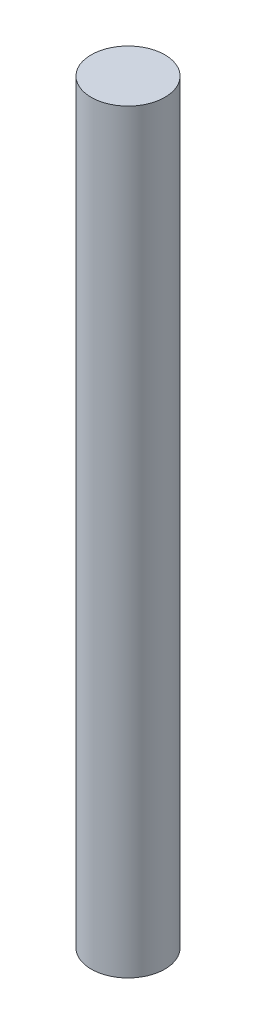
ISO-10303-21;
HEADER;
FILE_DESCRIPTION(('STEP AP214'),'2;1');
FILE_NAME('part.step','',(''),(''),'','','');
FILE_SCHEMA(('AUTOMOTIVE_DESIGN { 1 0 10303 214 1 1 1 1 }'));
ENDSEC;
DATA;
#1=APPLICATION_CONTEXT('core data for automotive mechanical design processes');
#2=APPLICATION_PROTOCOL_DEFINITION('international standard','automotive_design',2000,#1);
#3=PRODUCT_CONTEXT('',#1,'mechanical');
#4=PRODUCT('Part','Part','',(#3));
#5=PRODUCT_RELATED_PRODUCT_CATEGORY('part','',(#4));
#6=PRODUCT_DEFINITION_FORMATION('','',#4);
#7=PRODUCT_DEFINITION_CONTEXT('part definition',#1,'design');
#8=PRODUCT_DEFINITION('design','',#6,#7);
#9=PRODUCT_DEFINITION_SHAPE('','',#8);
#10=(LENGTH_UNIT() NAMED_UNIT(*) SI_UNIT(.MILLI.,.METRE.));
#11=(NAMED_UNIT(*) PLANE_ANGLE_UNIT() SI_UNIT($,.RADIAN.));
#12=(NAMED_UNIT(*) SI_UNIT($,.STERADIAN.) SOLID_ANGLE_UNIT());
#13=UNCERTAINTY_MEASURE_WITH_UNIT(LENGTH_MEASURE(1.E-05),#10,'distance_accuracy_value','');
#14=(GEOMETRIC_REPRESENTATION_CONTEXT(3) GLOBAL_UNCERTAINTY_ASSIGNED_CONTEXT((#13)) GLOBAL_UNIT_ASSIGNED_CONTEXT((#10,
#11,#12)) REPRESENTATION_CONTEXT('',''));
#15=CARTESIAN_POINT('',(0.,0.,0.));
#16=DIRECTION('',(0.,0.,1.));
#17=DIRECTION('',(1.,0.,0.));
#18=AXIS2_PLACEMENT_3D('',#15,#16,#17);
#19=CARTESIAN_POINT('',(0.,205.,0.));
#20=DIRECTION('',(0.,-1.,0.));
#21=DIRECTION('',(0.,0.,-1.));
#22=AXIS2_PLACEMENT_3D('',#19,#20,#21);
#23=CYLINDRICAL_SURFACE('',#22,10.);
#24=CARTESIAN_POINT('',(0.,205.,0.));
#25=DIRECTION('',(0.,1.,0.));
#26=DIRECTION('',(0.,0.,1.));
#27=AXIS2_PLACEMENT_3D('',#24,#25,#26);
#28=CIRCLE('',#27,10.);
#29=CARTESIAN_POINT('',(0.,205.,-10.));
#30=VERTEX_POINT('',#29);
#31=EDGE_CURVE('E10',#30,#30,#28,.T.);
#32=CARTESIAN_POINT('',(0.,0.,0.));
#33=DIRECTION('',(0.,1.,0.));
#34=DIRECTION('',(0.,0.,1.));
#35=AXIS2_PLACEMENT_3D('',#32,#33,#34);
#36=CIRCLE('',#35,10.);
#37=CARTESIAN_POINT('',(0.,0.,-10.));
#38=VERTEX_POINT('',#37);
#39=EDGE_CURVE('E38',#38,#38,#36,.T.);
#40=CARTESIAN_POINT('',(0.,205.,-10.));
#41=CARTESIAN_POINT('',(0.,202.864583333333,-10.));
#42=CARTESIAN_POINT('',(0.,200.729166666667,-10.));
#43=CARTESIAN_POINT('',(0.,196.458333333333,-10.));
#44=CARTESIAN_POINT('',(0.,194.322916666667,-10.));
#45=CARTESIAN_POINT('',(0.,190.052083333333,-10.));
#46=CARTESIAN_POINT('',(0.,187.916666666667,-10.));
#47=CARTESIAN_POINT('',(0.,183.645833333333,-10.));
#48=CARTESIAN_POINT('',(0.,181.510416666667,-10.));
#49=CARTESIAN_POINT('',(0.,177.239583333333,-10.));
#50=CARTESIAN_POINT('',(0.,175.104166666667,-10.));
#51=CARTESIAN_POINT('',(0.,170.833333333333,-10.));
#52=CARTESIAN_POINT('',(0.,168.697916666667,-10.));
#53=CARTESIAN_POINT('',(0.,164.427083333333,-10.));
#54=CARTESIAN_POINT('',(0.,162.291666666667,-10.));
#55=CARTESIAN_POINT('',(0.,158.020833333333,-10.));
#56=CARTESIAN_POINT('',(0.,155.885416666667,-10.));
#57=CARTESIAN_POINT('',(0.,151.614583333333,-10.));
#58=CARTESIAN_POINT('',(0.,149.479166666667,-10.));
#59=CARTESIAN_POINT('',(0.,145.208333333333,-10.));
#60=CARTESIAN_POINT('',(0.,143.072916666667,-10.));
#61=CARTESIAN_POINT('',(0.,138.802083333333,-10.));
#62=CARTESIAN_POINT('',(0.,136.666666666667,-10.));
#63=CARTESIAN_POINT('',(0.,132.395833333333,-10.));
#64=CARTESIAN_POINT('',(0.,130.260416666667,-10.));
#65=CARTESIAN_POINT('',(0.,125.989583333333,-10.));
#66=CARTESIAN_POINT('',(0.,123.854166666667,-10.));
#67=CARTESIAN_POINT('',(0.,119.583333333333,-10.));
#68=CARTESIAN_POINT('',(0.,117.447916666667,-10.));
#69=CARTESIAN_POINT('',(0.,113.177083333333,-10.));
#70=CARTESIAN_POINT('',(0.,111.041666666667,-10.));
#71=CARTESIAN_POINT('',(0.,106.770833333333,-10.));
#72=CARTESIAN_POINT('',(0.,104.635416666667,-10.));
#73=CARTESIAN_POINT('',(0.,100.364583333333,-10.));
#74=CARTESIAN_POINT('',(0.,98.2291666666667,-10.));
#75=CARTESIAN_POINT('',(0.,93.9583333333333,-10.));
#76=CARTESIAN_POINT('',(0.,91.8229166666667,-10.));
#77=CARTESIAN_POINT('',(0.,87.5520833333333,-10.));
#78=CARTESIAN_POINT('',(0.,85.4166666666667,-10.));
#79=CARTESIAN_POINT('',(0.,81.1458333333333,-10.));
#80=CARTESIAN_POINT('',(0.,79.0104166666667,-10.));
#81=CARTESIAN_POINT('',(0.,74.7395833333333,-10.));
#82=CARTESIAN_POINT('',(0.,72.6041666666667,-10.));
#83=CARTESIAN_POINT('',(0.,68.3333333333333,-10.));
#84=CARTESIAN_POINT('',(0.,66.1979166666667,-10.));
#85=CARTESIAN_POINT('',(0.,61.9270833333333,-10.));
#86=CARTESIAN_POINT('',(0.,59.7916666666667,-10.));
#87=CARTESIAN_POINT('',(0.,55.5208333333333,-10.));
#88=CARTESIAN_POINT('',(0.,53.3854166666667,-10.));
#89=CARTESIAN_POINT('',(0.,49.1145833333333,-10.));
#90=CARTESIAN_POINT('',(0.,46.9791666666667,-10.));
#91=CARTESIAN_POINT('',(0.,42.7083333333333,-10.));
#92=CARTESIAN_POINT('',(0.,40.5729166666667,-10.));
#93=CARTESIAN_POINT('',(0.,36.3020833333333,-10.));
#94=CARTESIAN_POINT('',(0.,34.1666666666667,-10.));
#95=CARTESIAN_POINT('',(0.,29.8958333333333,-10.));
#96=CARTESIAN_POINT('',(0.,27.7604166666667,-10.));
#97=CARTESIAN_POINT('',(0.,23.4895833333333,-10.));
#98=CARTESIAN_POINT('',(0.,21.3541666666667,-10.));
#99=CARTESIAN_POINT('',(0.,17.0833333333333,-10.));
#100=CARTESIAN_POINT('',(0.,14.9479166666667,-10.));
#101=CARTESIAN_POINT('',(0.,10.6770833333333,-10.));
#102=CARTESIAN_POINT('',(0.,8.54166666666667,-10.));
#103=CARTESIAN_POINT('',(0.,4.27083333333333,-10.));
#104=CARTESIAN_POINT('',(0.,2.13541666666667,-10.));
#105=CARTESIAN_POINT('',(0.,0.,-10.));
#106=B_SPLINE_CURVE_WITH_KNOTS('',3,(#40,#41,#42,#43,#44,#45,#46,#47,#48,#49,#50,#51,#52,#53,
#54,#55,#56,#57,#58,#59,#60,#61,#62,#63,#64,#65,#66,#67,#68,#69,#70,#71,#72,#73,#74,#75,#76,#77,
#78,#79,#80,#81,#82,#83,#84,#85,#86,#87,#88,#89,#90,#91,#92,#93,#94,#95,#96,#97,#98,#99,#100,
#101,#102,#103,#104,#105),.UNSPECIFIED.,.F.,.F.,(4,2,2,2,2,2,2,2,2,2,2,2,2,2,2,2,2,2,2,2,2,2,2,
2,2,2,2,2,2,2,2,2,4),(0.,6.40624999999997,12.8125,19.21875,25.625,32.03125,38.4375,44.84375,
51.25,57.65625,64.0625,70.46875,76.875,83.28125,89.6875,96.09375,102.5,108.90625,115.3125,
121.71875,128.125,134.53125,140.9375,147.34375,153.75,160.15625,166.5625,172.96875,179.375,
185.78125,192.1875,198.59375,205.),.UNSPECIFIED.);
#107=EDGE_CURVE('BSEAM35',#30,#38,#106,.T.);
#108=ORIENTED_EDGE('',*,*,#31,.F.);
#109=ORIENTED_EDGE('',*,*,#39,.T.);
#110=ORIENTED_EDGE('',*,*,#107,.T.);
#111=ORIENTED_EDGE('',*,*,#107,.F.);
#112=EDGE_LOOP('',(#108,#110,#109,#111));
#113=FACE_BOUND('',#112,.T.);
#114=ADVANCED_FACE('F35',(#113),#23,.T.);
#115=CARTESIAN_POINT('',(0.,205.,0.));
#116=DIRECTION('',(0.,1.,0.));
#117=DIRECTION('',(0.,0.,1.));
#118=AXIS2_PLACEMENT_3D('',#115,#116,#117);
#119=PLANE('',#118);
#120=ORIENTED_EDGE('',*,*,#31,.T.);
#121=EDGE_LOOP('',(#120));
#122=FACE_BOUND('',#121,.T.);
#123=ADVANCED_FACE('F50',(#122),#119,.T.);
#124=CARTESIAN_POINT('',(0.,0.,0.));
#125=DIRECTION('',(0.,1.,0.));
#126=DIRECTION('',(0.,0.,1.));
#127=AXIS2_PLACEMENT_3D('',#124,#125,#126);
#128=PLANE('',#127);
#129=ORIENTED_EDGE('',*,*,#39,.F.);
#130=EDGE_LOOP('',(#129));
#131=FACE_BOUND('',#130,.T.);
#132=ADVANCED_FACE('F48',(#131),#128,.F.);
#133=CLOSED_SHELL('',(#114,#123,#132));
#134=MANIFOLD_SOLID_BREP('B2',#133);
#135=ADVANCED_BREP_SHAPE_REPRESENTATION('',(#18,#134),#14);
#136=SHAPE_DEFINITION_REPRESENTATION(#9,#135);
ENDSEC;
END-ISO-10303-21;
